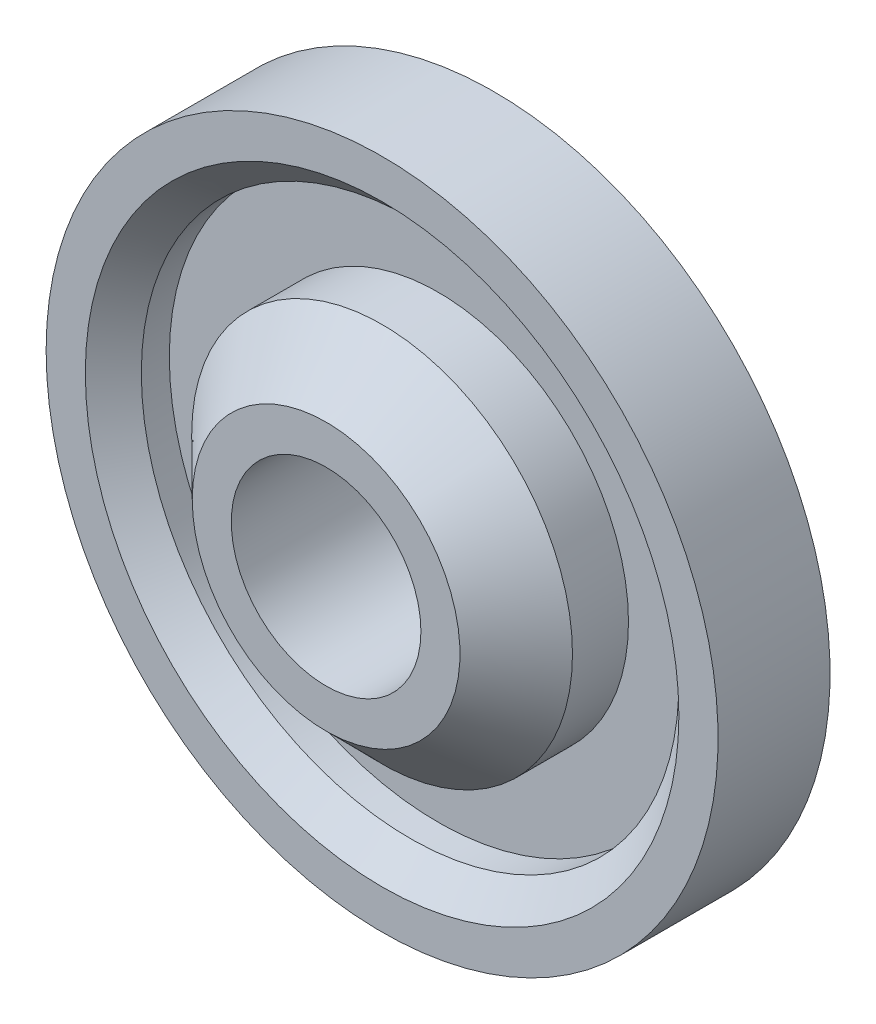
ISO-10303-21;
HEADER;
FILE_DESCRIPTION(('STEP AP214'),'2;1');
FILE_NAME('part.step','',(''),(''),'','','');
FILE_SCHEMA(('AUTOMOTIVE_DESIGN { 1 0 10303 214 1 1 1 1 }'));
ENDSEC;
DATA;
#1=APPLICATION_CONTEXT('core data for automotive mechanical design processes');
#2=APPLICATION_PROTOCOL_DEFINITION('international standard','automotive_design',2000,#1);
#3=PRODUCT_CONTEXT('',#1,'mechanical');
#4=PRODUCT('Part','Part','',(#3));
#5=PRODUCT_RELATED_PRODUCT_CATEGORY('part','',(#4));
#6=PRODUCT_DEFINITION_FORMATION('','',#4);
#7=PRODUCT_DEFINITION_CONTEXT('part definition',#1,'design');
#8=PRODUCT_DEFINITION('design','',#6,#7);
#9=PRODUCT_DEFINITION_SHAPE('','',#8);
#10=(LENGTH_UNIT() NAMED_UNIT(*) SI_UNIT(.MILLI.,.METRE.));
#11=(NAMED_UNIT(*) PLANE_ANGLE_UNIT() SI_UNIT($,.RADIAN.));
#12=(NAMED_UNIT(*) SI_UNIT($,.STERADIAN.) SOLID_ANGLE_UNIT());
#13=UNCERTAINTY_MEASURE_WITH_UNIT(LENGTH_MEASURE(1.E-05),#10,'distance_accuracy_value','');
#14=(GEOMETRIC_REPRESENTATION_CONTEXT(3) GLOBAL_UNCERTAINTY_ASSIGNED_CONTEXT((#13)) GLOBAL_UNIT_ASSIGNED_CONTEXT((#10,
#11,#12)) REPRESENTATION_CONTEXT('',''));
#15=CARTESIAN_POINT('',(0.,0.,0.));
#16=DIRECTION('',(0.,0.,1.));
#17=DIRECTION('',(1.,0.,0.));
#18=AXIS2_PLACEMENT_3D('',#15,#16,#17);
#19=CARTESIAN_POINT('',(0.,0.,0.));
#20=DIRECTION('',(0.,0.,1.));
#21=DIRECTION('',(1.,0.,0.));
#22=AXIS2_PLACEMENT_3D('',#19,#20,#21);
#23=PLANE('',#22);
#24=CARTESIAN_POINT('',(0.,0.,0.));
#25=DIRECTION('',(0.,0.,1.));
#26=DIRECTION('',(1.,0.,0.));
#27=AXIS2_PLACEMENT_3D('',#24,#25,#26);
#28=CIRCLE('',#27,1.6933);
#29=CARTESIAN_POINT('',(1.6933,0.,0.));
#30=VERTEX_POINT('',#29);
#31=EDGE_CURVE('E61',#30,#30,#28,.T.);
#32=ORIENTED_EDGE('',*,*,#31,.T.);
#33=EDGE_LOOP('',(#32));
#34=FACE_BOUND('',#33,.T.);
#35=CARTESIAN_POINT('',(0.,0.,0.));
#36=DIRECTION('',(0.,0.,-1.));
#37=DIRECTION('',(-1.,0.,0.));
#38=AXIS2_PLACEMENT_3D('',#35,#36,#37);
#39=CIRCLE('',#38,6.);
#40=CARTESIAN_POINT('',(-6.,0.,0.));
#41=VERTEX_POINT('',#40);
#42=EDGE_CURVE('E10',#41,#41,#39,.T.);
#43=ORIENTED_EDGE('',*,*,#42,.T.);
#44=EDGE_LOOP('',(#43));
#45=FACE_BOUND('',#44,.T.);
#46=ADVANCED_FACE('F30',(#34,#45),#23,.F.);
#47=CARTESIAN_POINT('',(0.,0.,0.));
#48=DIRECTION('',(0.,0.,-1.));
#49=DIRECTION('',(-1.,0.,0.));
#50=AXIS2_PLACEMENT_3D('',#47,#48,#49);
#51=CYLINDRICAL_SURFACE('',#50,6.);
#52=ORIENTED_EDGE('',*,*,#42,.F.);
#53=EDGE_LOOP('',(#52));
#54=FACE_BOUND('',#53,.T.);
#55=CARTESIAN_POINT('',(0.,0.,2.));
#56=DIRECTION('',(0.,0.,-1.));
#57=DIRECTION('',(-1.,0.,0.));
#58=AXIS2_PLACEMENT_3D('',#55,#56,#57);
#59=CIRCLE('',#58,6.);
#60=CARTESIAN_POINT('',(-6.,0.,2.));
#61=VERTEX_POINT('',#60);
#62=EDGE_CURVE('E36',#61,#61,#59,.T.);
#63=ORIENTED_EDGE('',*,*,#62,.T.);
#64=EDGE_LOOP('',(#63));
#65=FACE_BOUND('',#64,.T.);
#66=ADVANCED_FACE('F94',(#54,#65),#51,.T.);
#67=CARTESIAN_POINT('',(6.,0.,2.));
#68=DIRECTION('',(0.,0.,-1.));
#69=DIRECTION('',(-1.,0.,0.));
#70=AXIS2_PLACEMENT_3D('',#67,#68,#69);
#71=PLANE('',#70);
#72=ORIENTED_EDGE('',*,*,#62,.F.);
#73=EDGE_LOOP('',(#72));
#74=FACE_BOUND('',#73,.T.);
#75=CARTESIAN_POINT('',(0.,0.,2.));
#76=DIRECTION('',(0.,0.,-1.));
#77=DIRECTION('',(-1.,0.,0.));
#78=AXIS2_PLACEMENT_3D('',#75,#76,#77);
#79=CIRCLE('',#78,5.3);
#80=CARTESIAN_POINT('',(-5.3,0.,2.));
#81=VERTEX_POINT('',#80);
#82=EDGE_CURVE('E40',#81,#81,#79,.T.);
#83=ORIENTED_EDGE('',*,*,#82,.T.);
#84=EDGE_LOOP('',(#83));
#85=FACE_BOUND('',#84,.T.);
#86=ADVANCED_FACE('F98',(#74,#85),#71,.F.);
#87=CARTESIAN_POINT('',(0.,0.,1.5));
#88=DIRECTION('',(0.,0.,1.));
#89=DIRECTION('',(1.,0.,0.));
#90=AXIS2_PLACEMENT_3D('',#87,#88,#89);
#91=CONICAL_SURFACE('',#90,4.8,0.785398163397448);
#92=ORIENTED_EDGE('',*,*,#82,.F.);
#93=EDGE_LOOP('',(#92));
#94=FACE_BOUND('',#93,.T.);
#95=CARTESIAN_POINT('',(0.,0.,1.5));
#96=DIRECTION('',(0.,0.,-1.));
#97=DIRECTION('',(-1.,0.,0.));
#98=AXIS2_PLACEMENT_3D('',#95,#96,#97);
#99=CIRCLE('',#98,4.8);
#100=CARTESIAN_POINT('',(-4.8,0.,1.5));
#101=VERTEX_POINT('',#100);
#102=EDGE_CURVE('E44',#101,#101,#99,.T.);
#103=ORIENTED_EDGE('',*,*,#102,.T.);
#104=EDGE_LOOP('',(#103));
#105=FACE_BOUND('',#104,.T.);
#106=ADVANCED_FACE('F103',(#94,#105),#91,.F.);
#107=CARTESIAN_POINT('',(0.,0.,0.));
#108=DIRECTION('',(0.,0.,-1.));
#109=DIRECTION('',(-1.,0.,0.));
#110=AXIS2_PLACEMENT_3D('',#107,#108,#109);
#111=CYLINDRICAL_SURFACE('',#110,4.8);
#112=ORIENTED_EDGE('',*,*,#102,.F.);
#113=EDGE_LOOP('',(#112));
#114=FACE_BOUND('',#113,.T.);
#115=CARTESIAN_POINT('',(0.,0.,1.));
#116=DIRECTION('',(0.,0.,-1.));
#117=DIRECTION('',(-1.,0.,0.));
#118=AXIS2_PLACEMENT_3D('',#115,#116,#117);
#119=CIRCLE('',#118,4.8);
#120=CARTESIAN_POINT('',(-4.8,0.,1.));
#121=VERTEX_POINT('',#120);
#122=EDGE_CURVE('E49',#121,#121,#119,.T.);
#123=ORIENTED_EDGE('',*,*,#122,.T.);
#124=EDGE_LOOP('',(#123));
#125=FACE_BOUND('',#124,.T.);
#126=ADVANCED_FACE('F109',(#114,#125),#111,.F.);
#127=CARTESIAN_POINT('',(4.8,0.,1.));
#128=DIRECTION('',(0.,0.,-1.));
#129=DIRECTION('',(-1.,0.,0.));
#130=AXIS2_PLACEMENT_3D('',#127,#128,#129);
#131=PLANE('',#130);
#132=ORIENTED_EDGE('',*,*,#122,.F.);
#133=EDGE_LOOP('',(#132));
#134=FACE_BOUND('',#133,.T.);
#135=CARTESIAN_POINT('',(0.,0.,1.));
#136=DIRECTION('',(0.,0.,-1.));
#137=DIRECTION('',(-1.,0.,0.));
#138=AXIS2_PLACEMENT_3D('',#135,#136,#137);
#139=CIRCLE('',#138,3.4);
#140=CARTESIAN_POINT('',(-3.4,0.,1.));
#141=VERTEX_POINT('',#140);
#142=EDGE_CURVE('E52',#141,#141,#139,.T.);
#143=ORIENTED_EDGE('',*,*,#142,.T.);
#144=EDGE_LOOP('',(#143));
#145=FACE_BOUND('',#144,.T.);
#146=ADVANCED_FACE('F89',(#134,#145),#131,.F.);
#147=CARTESIAN_POINT('',(0.,0.,0.));
#148=DIRECTION('',(0.,0.,-1.));
#149=DIRECTION('',(-1.,0.,0.));
#150=AXIS2_PLACEMENT_3D('',#147,#148,#149);
#151=CYLINDRICAL_SURFACE('',#150,3.4);
#152=ORIENTED_EDGE('',*,*,#142,.F.);
#153=EDGE_LOOP('',(#152));
#154=FACE_BOUND('',#153,.T.);
#155=CARTESIAN_POINT('',(0.,0.,2.));
#156=DIRECTION('',(0.,0.,-1.));
#157=DIRECTION('',(-1.,0.,0.));
#158=AXIS2_PLACEMENT_3D('',#155,#156,#157);
#159=CIRCLE('',#158,3.4);
#160=CARTESIAN_POINT('',(-3.4,0.,2.));
#161=VERTEX_POINT('',#160);
#162=EDGE_CURVE('E55',#161,#161,#159,.T.);
#163=ORIENTED_EDGE('',*,*,#162,.T.);
#164=EDGE_LOOP('',(#163));
#165=FACE_BOUND('',#164,.T.);
#166=ADVANCED_FACE('F83',(#154,#165),#151,.T.);
#167=CARTESIAN_POINT('',(0.,0.,3.));
#168=DIRECTION('',(0.,0.,-1.));
#169=DIRECTION('',(-1.,0.,0.));
#170=AXIS2_PLACEMENT_3D('',#167,#168,#169);
#171=CONICAL_SURFACE('',#170,2.39055,0.790100908096298);
#172=ORIENTED_EDGE('',*,*,#162,.F.);
#173=EDGE_LOOP('',(#172));
#174=FACE_BOUND('',#173,.T.);
#175=CARTESIAN_POINT('',(0.,0.,3.));
#176=DIRECTION('',(0.,0.,-1.));
#177=DIRECTION('',(-1.,0.,0.));
#178=AXIS2_PLACEMENT_3D('',#175,#176,#177);
#179=CIRCLE('',#178,2.39055);
#180=CARTESIAN_POINT('',(-2.39055,0.,3.));
#181=VERTEX_POINT('',#180);
#182=EDGE_CURVE('E58',#181,#181,#179,.T.);
#183=ORIENTED_EDGE('',*,*,#182,.T.);
#184=EDGE_LOOP('',(#183));
#185=FACE_BOUND('',#184,.T.);
#186=ADVANCED_FACE('F78',(#174,#185),#171,.T.);
#187=CARTESIAN_POINT('',(2.39055,0.,3.));
#188=DIRECTION('',(0.,0.,-1.));
#189=DIRECTION('',(-1.,0.,0.));
#190=AXIS2_PLACEMENT_3D('',#187,#188,#189);
#191=PLANE('',#190);
#192=CARTESIAN_POINT('',(0.,0.,3.));
#193=DIRECTION('',(0.,0.,1.));
#194=DIRECTION('',(1.,0.,0.));
#195=AXIS2_PLACEMENT_3D('',#192,#193,#194);
#196=CIRCLE('',#195,1.6933);
#197=CARTESIAN_POINT('',(1.6933,0.,3.));
#198=VERTEX_POINT('',#197);
#199=EDGE_CURVE('E62',#198,#198,#196,.T.);
#200=ORIENTED_EDGE('',*,*,#199,.F.);
#201=EDGE_LOOP('',(#200));
#202=FACE_BOUND('',#201,.T.);
#203=ORIENTED_EDGE('',*,*,#182,.F.);
#204=EDGE_LOOP('',(#203));
#205=FACE_BOUND('',#204,.T.);
#206=ADVANCED_FACE('F72',(#202,#205),#191,.F.);
#207=CARTESIAN_POINT('',(0.,0.,0.));
#208=DIRECTION('',(0.,0.,1.));
#209=DIRECTION('',(1.,0.,0.));
#210=AXIS2_PLACEMENT_3D('',#207,#208,#209);
#211=CYLINDRICAL_SURFACE('',#210,1.6933);
#212=ORIENTED_EDGE('',*,*,#31,.F.);
#213=EDGE_LOOP('',(#212));
#214=FACE_BOUND('',#213,.T.);
#215=ORIENTED_EDGE('',*,*,#199,.T.);
#216=EDGE_LOOP('',(#215));
#217=FACE_BOUND('',#216,.T.);
#218=ADVANCED_FACE('F69',(#214,#217),#211,.F.);
#219=CLOSED_SHELL('',(#46,#66,#86,#106,#126,#146,#166,#186,#206,#218));
#220=MANIFOLD_SOLID_BREP('B2',#219);
#221=ADVANCED_BREP_SHAPE_REPRESENTATION('',(#18,#220),#14);
#222=SHAPE_DEFINITION_REPRESENTATION(#9,#221);
ENDSEC;
END-ISO-10303-21;
